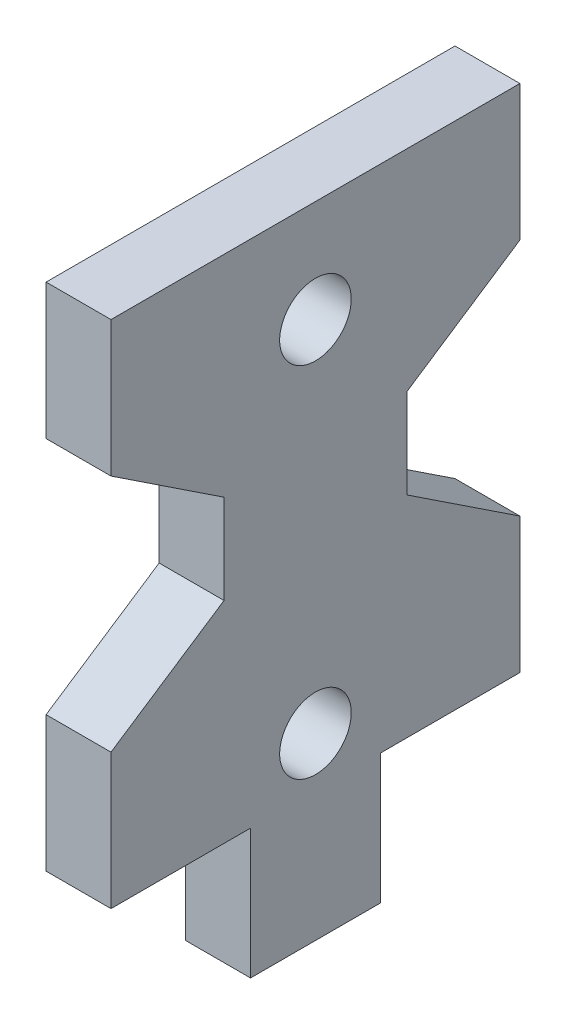
ISO-10303-21;
HEADER;
FILE_DESCRIPTION(('STEP AP214'),'2;1');
FILE_NAME('part.step','',(''),(''),'','','');
FILE_SCHEMA(('AUTOMOTIVE_DESIGN { 1 0 10303 214 1 1 1 1 }'));
ENDSEC;
DATA;
#1=APPLICATION_CONTEXT('core data for automotive mechanical design processes');
#2=APPLICATION_PROTOCOL_DEFINITION('international standard','automotive_design',2000,#1);
#3=PRODUCT_CONTEXT('',#1,'mechanical');
#4=PRODUCT('Part','Part','',(#3));
#5=PRODUCT_RELATED_PRODUCT_CATEGORY('part','',(#4));
#6=PRODUCT_DEFINITION_FORMATION('','',#4);
#7=PRODUCT_DEFINITION_CONTEXT('part definition',#1,'design');
#8=PRODUCT_DEFINITION('design','',#6,#7);
#9=PRODUCT_DEFINITION_SHAPE('','',#8);
#10=(LENGTH_UNIT() NAMED_UNIT(*) SI_UNIT(.MILLI.,.METRE.));
#11=(NAMED_UNIT(*) PLANE_ANGLE_UNIT() SI_UNIT($,.RADIAN.));
#12=(NAMED_UNIT(*) SI_UNIT($,.STERADIAN.) SOLID_ANGLE_UNIT());
#13=UNCERTAINTY_MEASURE_WITH_UNIT(LENGTH_MEASURE(1.E-05),#10,'distance_accuracy_value','');
#14=(GEOMETRIC_REPRESENTATION_CONTEXT(3) GLOBAL_UNCERTAINTY_ASSIGNED_CONTEXT((#13)) GLOBAL_UNIT_ASSIGNED_CONTEXT((#10,
#11,#12)) REPRESENTATION_CONTEXT('',''));
#15=CARTESIAN_POINT('',(0.,0.,0.));
#16=DIRECTION('',(0.,0.,1.));
#17=DIRECTION('',(1.,0.,0.));
#18=AXIS2_PLACEMENT_3D('',#15,#16,#17);
#19=CARTESIAN_POINT('',(3.175,0.,0.));
#20=DIRECTION('',(-1.,0.,0.));
#21=DIRECTION('',(0.,0.,1.));
#22=AXIS2_PLACEMENT_3D('',#19,#20,#21);
#23=PLANE('',#22);
#24=DIRECTION('',(0.,-1.,0.));
#25=VECTOR('',#24,1.);
#26=CARTESIAN_POINT('',(3.175,0.,0.));
#27=LINE('',#26,#25);
#28=CARTESIAN_POINT('',(3.175,6.62957401350551,0.));
#29=VERTEX_POINT('',#28);
#30=CARTESIAN_POINT('',(3.175,0.,0.));
#31=VERTEX_POINT('',#30);
#32=EDGE_CURVE('E236',#29,#31,#27,.T.);
#33=ORIENTED_EDGE('',*,*,#32,.T.);
#34=DIRECTION('',(0.,0.,-1.));
#35=VECTOR('',#34,1.);
#36=CARTESIAN_POINT('',(3.175,0.,0.));
#37=LINE('',#36,#35);
#38=CARTESIAN_POINT('',(3.175,0.,-6.825));
#39=VERTEX_POINT('',#38);
#40=EDGE_CURVE('E124',#31,#39,#37,.T.);
#41=ORIENTED_EDGE('',*,*,#40,.T.);
#42=DIRECTION('',(0.,-1.,0.));
#43=VECTOR('',#42,1.);
#44=CARTESIAN_POINT('',(3.175,-6.35,-6.825));
#45=LINE('',#44,#43);
#46=CARTESIAN_POINT('',(3.175,-6.35,-6.825));
#47=VERTEX_POINT('',#46);
#48=EDGE_CURVE('E289',#39,#47,#45,.T.);
#49=ORIENTED_EDGE('',*,*,#48,.T.);
#50=DIRECTION('',(0.,0.,-1.));
#51=VECTOR('',#50,1.);
#52=CARTESIAN_POINT('',(3.175,-6.35,-6.825));
#53=LINE('',#52,#51);
#54=CARTESIAN_POINT('',(3.175,-6.35,-13.175));
#55=VERTEX_POINT('',#54);
#56=EDGE_CURVE('E309',#47,#55,#53,.T.);
#57=ORIENTED_EDGE('',*,*,#56,.T.);
#58=DIRECTION('',(0.,1.,0.));
#59=VECTOR('',#58,1.);
#60=CARTESIAN_POINT('',(3.175,-6.35,-13.175));
#61=LINE('',#60,#59);
#62=CARTESIAN_POINT('',(3.175,0.,-13.175));
#63=VERTEX_POINT('',#62);
#64=EDGE_CURVE('E305',#55,#63,#61,.T.);
#65=ORIENTED_EDGE('',*,*,#64,.T.);
#66=DIRECTION('',(0.,0.,-1.));
#67=VECTOR('',#66,1.);
#68=CARTESIAN_POINT('',(3.175,0.,-13.175));
#69=LINE('',#68,#67);
#70=CARTESIAN_POINT('',(3.175,0.,-20.));
#71=VERTEX_POINT('',#70);
#72=EDGE_CURVE('E308',#63,#71,#69,.T.);
#73=ORIENTED_EDGE('',*,*,#72,.T.);
#74=DIRECTION('',(0.,1.,0.));
#75=VECTOR('',#74,1.);
#76=CARTESIAN_POINT('',(3.175,0.,-20.));
#77=LINE('',#76,#75);
#78=CARTESIAN_POINT('',(3.175,6.62957401350551,-20.));
#79=VERTEX_POINT('',#78);
#80=EDGE_CURVE('E313',#71,#79,#77,.T.);
#81=ORIENTED_EDGE('',*,*,#80,.T.);
#82=DIRECTION('',(0.,0.551893403229435,0.83391466678062));
#83=VECTOR('',#82,1.);
#84=CARTESIAN_POINT('',(3.175,10.2883921777805,-14.4715009956301));
#85=LINE('',#84,#83);
#86=CARTESIAN_POINT('',(3.175,10.2883921777805,-14.4715009956301));
#87=VERTEX_POINT('',#86);
#88=EDGE_CURVE('E320',#79,#87,#85,.T.);
#89=ORIENTED_EDGE('',*,*,#88,.T.);
#90=DIRECTION('',(0.,1.,0.));
#91=VECTOR('',#90,1.);
#92=CARTESIAN_POINT('',(3.175,14.6636026222195,-14.4715009956301));
#93=LINE('',#92,#91);
#94=CARTESIAN_POINT('',(3.175,14.6636026222195,-14.4715009956301));
#95=VERTEX_POINT('',#94);
#96=EDGE_CURVE('E323',#87,#95,#93,.T.);
#97=ORIENTED_EDGE('',*,*,#96,.T.);
#98=DIRECTION('',(0.,0.551893403229435,-0.83391466678062));
#99=VECTOR('',#98,1.);
#100=CARTESIAN_POINT('',(3.175,18.3224207864945,-20.));
#101=LINE('',#100,#99);
#102=CARTESIAN_POINT('',(3.175,18.3224207864945,-20.));
#103=VERTEX_POINT('',#102);
#104=EDGE_CURVE('E326',#95,#103,#101,.T.);
#105=ORIENTED_EDGE('',*,*,#104,.T.);
#106=DIRECTION('',(0.,1.,0.));
#107=VECTOR('',#106,1.);
#108=CARTESIAN_POINT('',(3.175,18.3224207864945,-20.));
#109=LINE('',#108,#107);
#110=CARTESIAN_POINT('',(3.175,24.9519948,-20.));
#111=VERTEX_POINT('',#110);
#112=EDGE_CURVE('E329',#103,#111,#109,.T.);
#113=ORIENTED_EDGE('',*,*,#112,.T.);
#114=DIRECTION('',(0.,0.,1.));
#115=VECTOR('',#114,1.);
#116=CARTESIAN_POINT('',(3.175,24.9519948,0.));
#117=LINE('',#116,#115);
#118=CARTESIAN_POINT('',(3.175,24.9519948,0.));
#119=VERTEX_POINT('',#118);
#120=EDGE_CURVE('E332',#111,#119,#117,.T.);
#121=ORIENTED_EDGE('',*,*,#120,.T.);
#122=DIRECTION('',(0.,-1.,0.));
#123=VECTOR('',#122,1.);
#124=CARTESIAN_POINT('',(3.175,18.3224207864945,0.));
#125=LINE('',#124,#123);
#126=CARTESIAN_POINT('',(3.175,18.3224207864945,0.));
#127=VERTEX_POINT('',#126);
#128=EDGE_CURVE('E167',#119,#127,#125,.T.);
#129=ORIENTED_EDGE('',*,*,#128,.T.);
#130=DIRECTION('',(0.,-0.551893403229435,-0.83391466678062));
#131=VECTOR('',#130,1.);
#132=CARTESIAN_POINT('',(3.175,18.3224207864945,0.));
#133=LINE('',#132,#131);
#134=CARTESIAN_POINT('',(3.175,14.6636026222195,-5.52849900436991));
#135=VERTEX_POINT('',#134);
#136=EDGE_CURVE('E161',#127,#135,#133,.T.);
#137=ORIENTED_EDGE('',*,*,#136,.T.);
#138=DIRECTION('',(0.,-1.,0.));
#139=VECTOR('',#138,1.);
#140=CARTESIAN_POINT('',(3.175,14.6636026222195,-5.52849900436991));
#141=LINE('',#140,#139);
#142=CARTESIAN_POINT('',(3.175,10.2883921777805,-5.52849900436991));
#143=VERTEX_POINT('',#142);
#144=EDGE_CURVE('E165',#135,#143,#141,.T.);
#145=ORIENTED_EDGE('',*,*,#144,.T.);
#146=DIRECTION('',(0.,-0.551893403229435,0.83391466678062));
#147=VECTOR('',#146,1.);
#148=CARTESIAN_POINT('',(3.175,10.2883921777805,-5.52849900436991));
#149=LINE('',#148,#147);
#150=EDGE_CURVE('E57',#143,#29,#149,.T.);
#151=ORIENTED_EDGE('',*,*,#150,.T.);
#152=EDGE_LOOP('',(#33,#41,#49,#57,#65,#73,#81,#89,#97,#105,#113,#121,#129,#137,#145,#151));
#153=FACE_BOUND('',#152,.T.);
#154=CARTESIAN_POINT('',(3.175,19.9519948,-10.));
#155=DIRECTION('',(1.,0.,0.));
#156=DIRECTION('',(0.,0.,-1.));
#157=AXIS2_PLACEMENT_3D('',#154,#155,#156);
#158=CIRCLE('',#157,1.75);
#159=CARTESIAN_POINT('',(3.175,19.9519948,-11.75));
#160=VERTEX_POINT('',#159);
#161=EDGE_CURVE('E194',#160,#160,#158,.T.);
#162=ORIENTED_EDGE('',*,*,#161,.F.);
#163=EDGE_LOOP('',(#162));
#164=FACE_BOUND('',#163,.T.);
#165=CARTESIAN_POINT('',(3.175,2.4259948,-10.));
#166=DIRECTION('',(1.,0.,0.));
#167=DIRECTION('',(0.,0.,-1.));
#168=AXIS2_PLACEMENT_3D('',#165,#166,#167);
#169=CIRCLE('',#168,1.75);
#170=CARTESIAN_POINT('',(3.175,2.4259948,-11.75));
#171=VERTEX_POINT('',#170);
#172=EDGE_CURVE('E375',#171,#171,#169,.T.);
#173=ORIENTED_EDGE('',*,*,#172,.F.);
#174=EDGE_LOOP('',(#173));
#175=FACE_BOUND('',#174,.T.);
#176=ADVANCED_FACE('F39',(#153,#164,#175),#23,.F.);
#177=CARTESIAN_POINT('',(0.,0.,0.));
#178=DIRECTION('',(-1.,0.,0.));
#179=DIRECTION('',(0.,0.,1.));
#180=AXIS2_PLACEMENT_3D('',#177,#178,#179);
#181=PLANE('',#180);
#182=CARTESIAN_POINT('',(0.,19.9519948,-10.));
#183=DIRECTION('',(1.,0.,0.));
#184=DIRECTION('',(0.,0.,-1.));
#185=AXIS2_PLACEMENT_3D('',#182,#183,#184);
#186=CIRCLE('',#185,1.75);
#187=CARTESIAN_POINT('',(0.,19.9519948,-11.75));
#188=VERTEX_POINT('',#187);
#189=EDGE_CURVE('E382',#188,#188,#186,.T.);
#190=ORIENTED_EDGE('',*,*,#189,.T.);
#191=EDGE_LOOP('',(#190));
#192=FACE_BOUND('',#191,.T.);
#193=DIRECTION('',(0.,-1.,0.));
#194=VECTOR('',#193,1.);
#195=CARTESIAN_POINT('',(0.,0.,0.));
#196=LINE('',#195,#194);
#197=CARTESIAN_POINT('',(0.,6.62957401350551,0.));
#198=VERTEX_POINT('',#197);
#199=CARTESIAN_POINT('',(0.,0.,0.));
#200=VERTEX_POINT('',#199);
#201=EDGE_CURVE('E189',#198,#200,#196,.T.);
#202=ORIENTED_EDGE('',*,*,#201,.F.);
#203=DIRECTION('',(0.,-0.551893403229435,0.83391466678062));
#204=VECTOR('',#203,1.);
#205=CARTESIAN_POINT('',(0.,10.2883921777805,-5.52849900436991));
#206=LINE('',#205,#204);
#207=CARTESIAN_POINT('',(0.,10.2883921777805,-5.52849900436991));
#208=VERTEX_POINT('',#207);
#209=EDGE_CURVE('E116',#208,#198,#206,.T.);
#210=ORIENTED_EDGE('',*,*,#209,.F.);
#211=DIRECTION('',(0.,-1.,0.));
#212=VECTOR('',#211,1.);
#213=CARTESIAN_POINT('',(0.,14.6636026222195,-5.52849900436991));
#214=LINE('',#213,#212);
#215=CARTESIAN_POINT('',(0.,14.6636026222195,-5.52849900436991));
#216=VERTEX_POINT('',#215);
#217=EDGE_CURVE('E110',#216,#208,#214,.T.);
#218=ORIENTED_EDGE('',*,*,#217,.F.);
#219=DIRECTION('',(0.,-0.551893403229435,-0.83391466678062));
#220=VECTOR('',#219,1.);
#221=CARTESIAN_POINT('',(0.,18.3224207864945,0.));
#222=LINE('',#221,#220);
#223=CARTESIAN_POINT('',(0.,18.3224207864945,0.));
#224=VERTEX_POINT('',#223);
#225=EDGE_CURVE('E176',#224,#216,#222,.T.);
#226=ORIENTED_EDGE('',*,*,#225,.F.);
#227=DIRECTION('',(0.,-1.,0.));
#228=VECTOR('',#227,1.);
#229=CARTESIAN_POINT('',(0.,18.3224207864945,0.));
#230=LINE('',#229,#228);
#231=CARTESIAN_POINT('',(0.,24.9519948,0.));
#232=VERTEX_POINT('',#231);
#233=EDGE_CURVE('E227',#232,#224,#230,.T.);
#234=ORIENTED_EDGE('',*,*,#233,.F.);
#235=DIRECTION('',(0.,0.,1.));
#236=VECTOR('',#235,1.);
#237=CARTESIAN_POINT('',(0.,24.9519948,0.));
#238=LINE('',#237,#236);
#239=CARTESIAN_POINT('',(0.,24.9519948,-20.));
#240=VERTEX_POINT('',#239);
#241=EDGE_CURVE('E224',#240,#232,#238,.T.);
#242=ORIENTED_EDGE('',*,*,#241,.F.);
#243=DIRECTION('',(0.,1.,0.));
#244=VECTOR('',#243,1.);
#245=CARTESIAN_POINT('',(0.,18.3224207864945,-20.));
#246=LINE('',#245,#244);
#247=CARTESIAN_POINT('',(0.,18.3224207864945,-20.));
#248=VERTEX_POINT('',#247);
#249=EDGE_CURVE('E221',#248,#240,#246,.T.);
#250=ORIENTED_EDGE('',*,*,#249,.F.);
#251=DIRECTION('',(0.,0.551893403229435,-0.83391466678062));
#252=VECTOR('',#251,1.);
#253=CARTESIAN_POINT('',(0.,18.3224207864945,-20.));
#254=LINE('',#253,#252);
#255=CARTESIAN_POINT('',(0.,14.6636026222195,-14.4715009956301));
#256=VERTEX_POINT('',#255);
#257=EDGE_CURVE('E218',#256,#248,#254,.T.);
#258=ORIENTED_EDGE('',*,*,#257,.F.);
#259=DIRECTION('',(0.,1.,0.));
#260=VECTOR('',#259,1.);
#261=CARTESIAN_POINT('',(0.,14.6636026222195,-14.4715009956301));
#262=LINE('',#261,#260);
#263=CARTESIAN_POINT('',(0.,10.2883921777805,-14.4715009956301));
#264=VERTEX_POINT('',#263);
#265=EDGE_CURVE('E215',#264,#256,#262,.T.);
#266=ORIENTED_EDGE('',*,*,#265,.F.);
#267=DIRECTION('',(0.,0.551893403229435,0.83391466678062));
#268=VECTOR('',#267,1.);
#269=CARTESIAN_POINT('',(0.,10.2883921777805,-14.4715009956301));
#270=LINE('',#269,#268);
#271=CARTESIAN_POINT('',(0.,6.62957401350551,-20.));
#272=VERTEX_POINT('',#271);
#273=EDGE_CURVE('E212',#272,#264,#270,.T.);
#274=ORIENTED_EDGE('',*,*,#273,.F.);
#275=DIRECTION('',(0.,1.,0.));
#276=VECTOR('',#275,1.);
#277=CARTESIAN_POINT('',(0.,0.,-20.));
#278=LINE('',#277,#276);
#279=CARTESIAN_POINT('',(0.,0.,-20.));
#280=VERTEX_POINT('',#279);
#281=EDGE_CURVE('E209',#280,#272,#278,.T.);
#282=ORIENTED_EDGE('',*,*,#281,.F.);
#283=DIRECTION('',(0.,0.,-1.));
#284=VECTOR('',#283,1.);
#285=CARTESIAN_POINT('',(0.,0.,-13.175));
#286=LINE('',#285,#284);
#287=CARTESIAN_POINT('',(0.,0.,-13.175));
#288=VERTEX_POINT('',#287);
#289=EDGE_CURVE('E206',#288,#280,#286,.T.);
#290=ORIENTED_EDGE('',*,*,#289,.F.);
#291=DIRECTION('',(0.,1.,0.));
#292=VECTOR('',#291,1.);
#293=CARTESIAN_POINT('',(0.,-6.35,-13.175));
#294=LINE('',#293,#292);
#295=CARTESIAN_POINT('',(0.,-6.35,-13.175));
#296=VERTEX_POINT('',#295);
#297=EDGE_CURVE('E203',#296,#288,#294,.T.);
#298=ORIENTED_EDGE('',*,*,#297,.F.);
#299=DIRECTION('',(0.,0.,-1.));
#300=VECTOR('',#299,1.);
#301=CARTESIAN_POINT('',(0.,-6.35,-6.825));
#302=LINE('',#301,#300);
#303=CARTESIAN_POINT('',(0.,-6.35,-6.825));
#304=VERTEX_POINT('',#303);
#305=EDGE_CURVE('E200',#304,#296,#302,.T.);
#306=ORIENTED_EDGE('',*,*,#305,.F.);
#307=DIRECTION('',(0.,-1.,0.));
#308=VECTOR('',#307,1.);
#309=CARTESIAN_POINT('',(0.,-6.35,-6.825));
#310=LINE('',#309,#308);
#311=CARTESIAN_POINT('',(0.,0.,-6.825));
#312=VERTEX_POINT('',#311);
#313=EDGE_CURVE('E197',#312,#304,#310,.T.);
#314=ORIENTED_EDGE('',*,*,#313,.F.);
#315=DIRECTION('',(0.,0.,-1.));
#316=VECTOR('',#315,1.);
#317=CARTESIAN_POINT('',(0.,0.,0.));
#318=LINE('',#317,#316);
#319=EDGE_CURVE('E193',#200,#312,#318,.T.);
#320=ORIENTED_EDGE('',*,*,#319,.F.);
#321=EDGE_LOOP('',(#202,#210,#218,#226,#234,#242,#250,#258,#266,#274,#282,#290,#298,#306,#314,#320));
#322=FACE_BOUND('',#321,.T.);
#323=CARTESIAN_POINT('',(0.,2.4259948,-10.));
#324=DIRECTION('',(1.,0.,0.));
#325=DIRECTION('',(0.,0.,-1.));
#326=AXIS2_PLACEMENT_3D('',#323,#324,#325);
#327=CIRCLE('',#326,1.75);
#328=CARTESIAN_POINT('',(0.,2.4259948,-11.75));
#329=VERTEX_POINT('',#328);
#330=EDGE_CURVE('E378',#329,#329,#327,.T.);
#331=ORIENTED_EDGE('',*,*,#330,.T.);
#332=EDGE_LOOP('',(#331));
#333=FACE_BOUND('',#332,.T.);
#334=ADVANCED_FACE('F293',(#192,#322,#333),#181,.T.);
#335=CARTESIAN_POINT('',(3.175,0.,0.));
#336=DIRECTION('',(0.,0.,-1.));
#337=DIRECTION('',(-1.,0.,0.));
#338=AXIS2_PLACEMENT_3D('',#335,#336,#337);
#339=PLANE('',#338);
#340=ORIENTED_EDGE('',*,*,#201,.T.);
#341=DIRECTION('',(-1.,0.,0.));
#342=VECTOR('',#341,1.);
#343=CARTESIAN_POINT('',(3.175,0.,0.));
#344=LINE('',#343,#342);
#345=EDGE_CURVE('E11',#31,#200,#344,.T.);
#346=ORIENTED_EDGE('',*,*,#345,.F.);
#347=ORIENTED_EDGE('',*,*,#32,.F.);
#348=DIRECTION('',(-1.,0.,0.));
#349=VECTOR('',#348,1.);
#350=CARTESIAN_POINT('',(3.175,6.62957401350551,0.));
#351=LINE('',#350,#349);
#352=EDGE_CURVE('E185',#29,#198,#351,.T.);
#353=ORIENTED_EDGE('',*,*,#352,.T.);
#354=EDGE_LOOP('',(#340,#346,#347,#353));
#355=FACE_BOUND('',#354,.T.);
#356=ADVANCED_FACE('F41',(#355),#339,.F.);
#357=CARTESIAN_POINT('',(3.175,0.,0.));
#358=DIRECTION('',(0.,1.,0.));
#359=DIRECTION('',(0.,0.,1.));
#360=AXIS2_PLACEMENT_3D('',#357,#358,#359);
#361=PLANE('',#360);
#362=ORIENTED_EDGE('',*,*,#319,.T.);
#363=DIRECTION('',(-1.,0.,0.));
#364=VECTOR('',#363,1.);
#365=CARTESIAN_POINT('',(3.175,0.,-6.825));
#366=LINE('',#365,#364);
#367=EDGE_CURVE('E49',#39,#312,#366,.T.);
#368=ORIENTED_EDGE('',*,*,#367,.F.);
#369=ORIENTED_EDGE('',*,*,#40,.F.);
#370=ORIENTED_EDGE('',*,*,#345,.T.);
#371=EDGE_LOOP('',(#362,#368,#369,#370));
#372=FACE_BOUND('',#371,.T.);
#373=ADVANCED_FACE('F522',(#372),#361,.F.);
#374=CARTESIAN_POINT('',(3.175,-6.35,-6.825));
#375=DIRECTION('',(0.,0.,-1.));
#376=DIRECTION('',(-1.,0.,0.));
#377=AXIS2_PLACEMENT_3D('',#374,#375,#376);
#378=PLANE('',#377);
#379=ORIENTED_EDGE('',*,*,#313,.T.);
#380=DIRECTION('',(-1.,0.,0.));
#381=VECTOR('',#380,1.);
#382=CARTESIAN_POINT('',(3.175,-6.35,-6.825));
#383=LINE('',#382,#381);
#384=EDGE_CURVE('E279',#47,#304,#383,.T.);
#385=ORIENTED_EDGE('',*,*,#384,.F.);
#386=ORIENTED_EDGE('',*,*,#48,.F.);
#387=ORIENTED_EDGE('',*,*,#367,.T.);
#388=EDGE_LOOP('',(#379,#385,#386,#387));
#389=FACE_BOUND('',#388,.T.);
#390=ADVANCED_FACE('F287',(#389),#378,.F.);
#391=CARTESIAN_POINT('',(3.175,-6.35,-6.825));
#392=DIRECTION('',(0.,1.,0.));
#393=DIRECTION('',(0.,0.,1.));
#394=AXIS2_PLACEMENT_3D('',#391,#392,#393);
#395=PLANE('',#394);
#396=ORIENTED_EDGE('',*,*,#305,.T.);
#397=DIRECTION('',(-1.,0.,0.));
#398=VECTOR('',#397,1.);
#399=CARTESIAN_POINT('',(3.175,-6.35,-13.175));
#400=LINE('',#399,#398);
#401=EDGE_CURVE('E275',#55,#296,#400,.T.);
#402=ORIENTED_EDGE('',*,*,#401,.F.);
#403=ORIENTED_EDGE('',*,*,#56,.F.);
#404=ORIENTED_EDGE('',*,*,#384,.T.);
#405=EDGE_LOOP('',(#396,#402,#403,#404));
#406=FACE_BOUND('',#405,.T.);
#407=ADVANCED_FACE('F299',(#406),#395,.F.);
#408=CARTESIAN_POINT('',(3.175,-6.35,-13.175));
#409=DIRECTION('',(0.,0.,1.));
#410=DIRECTION('',(1.,0.,0.));
#411=AXIS2_PLACEMENT_3D('',#408,#409,#410);
#412=PLANE('',#411);
#413=ORIENTED_EDGE('',*,*,#297,.T.);
#414=DIRECTION('',(-1.,0.,0.));
#415=VECTOR('',#414,1.);
#416=CARTESIAN_POINT('',(3.175,0.,-13.175));
#417=LINE('',#416,#415);
#418=EDGE_CURVE('E271',#63,#288,#417,.T.);
#419=ORIENTED_EDGE('',*,*,#418,.F.);
#420=ORIENTED_EDGE('',*,*,#64,.F.);
#421=ORIENTED_EDGE('',*,*,#401,.T.);
#422=EDGE_LOOP('',(#413,#419,#420,#421));
#423=FACE_BOUND('',#422,.T.);
#424=ADVANCED_FACE('F303',(#423),#412,.F.);
#425=CARTESIAN_POINT('',(3.175,0.,-13.175));
#426=DIRECTION('',(0.,1.,0.));
#427=DIRECTION('',(0.,0.,1.));
#428=AXIS2_PLACEMENT_3D('',#425,#426,#427);
#429=PLANE('',#428);
#430=ORIENTED_EDGE('',*,*,#289,.T.);
#431=DIRECTION('',(-1.,0.,0.));
#432=VECTOR('',#431,1.);
#433=CARTESIAN_POINT('',(3.175,0.,-20.));
#434=LINE('',#433,#432);
#435=EDGE_CURVE('E267',#71,#280,#434,.T.);
#436=ORIENTED_EDGE('',*,*,#435,.F.);
#437=ORIENTED_EDGE('',*,*,#72,.F.);
#438=ORIENTED_EDGE('',*,*,#418,.T.);
#439=EDGE_LOOP('',(#430,#436,#437,#438));
#440=FACE_BOUND('',#439,.T.);
#441=ADVANCED_FACE('F487',(#440),#429,.F.);
#442=CARTESIAN_POINT('',(3.175,0.,-20.));
#443=DIRECTION('',(0.,0.,1.));
#444=DIRECTION('',(0.,-1.,0.));
#445=AXIS2_PLACEMENT_3D('',#442,#443,#444);
#446=PLANE('',#445);
#447=ORIENTED_EDGE('',*,*,#281,.T.);
#448=DIRECTION('',(-1.,0.,0.));
#449=VECTOR('',#448,1.);
#450=CARTESIAN_POINT('',(3.175,6.62957401350551,-20.));
#451=LINE('',#450,#449);
#452=EDGE_CURVE('E263',#79,#272,#451,.T.);
#453=ORIENTED_EDGE('',*,*,#452,.F.);
#454=ORIENTED_EDGE('',*,*,#80,.F.);
#455=ORIENTED_EDGE('',*,*,#435,.T.);
#456=EDGE_LOOP('',(#447,#453,#454,#455));
#457=FACE_BOUND('',#456,.T.);
#458=ADVANCED_FACE('F477',(#457),#446,.F.);
#459=CARTESIAN_POINT('',(3.175,10.2883921777805,-14.4715009956301));
#460=DIRECTION('',(0.,-0.83391466678062,0.551893403229435));
#461=DIRECTION('',(0.,-0.551893403229435,-0.83391466678062));
#462=AXIS2_PLACEMENT_3D('',#459,#460,#461);
#463=PLANE('',#462);
#464=ORIENTED_EDGE('',*,*,#273,.T.);
#465=DIRECTION('',(-1.,0.,0.));
#466=VECTOR('',#465,1.);
#467=CARTESIAN_POINT('',(3.175,10.2883921777805,-14.4715009956301));
#468=LINE('',#467,#466);
#469=EDGE_CURVE('E259',#87,#264,#468,.T.);
#470=ORIENTED_EDGE('',*,*,#469,.F.);
#471=ORIENTED_EDGE('',*,*,#88,.F.);
#472=ORIENTED_EDGE('',*,*,#452,.T.);
#473=EDGE_LOOP('',(#464,#470,#471,#472));
#474=FACE_BOUND('',#473,.T.);
#475=ADVANCED_FACE('F467',(#474),#463,.F.);
#476=CARTESIAN_POINT('',(3.175,14.6636026222195,-14.4715009956301));
#477=DIRECTION('',(0.,0.,1.));
#478=DIRECTION('',(0.,-1.,0.));
#479=AXIS2_PLACEMENT_3D('',#476,#477,#478);
#480=PLANE('',#479);
#481=ORIENTED_EDGE('',*,*,#265,.T.);
#482=DIRECTION('',(-1.,0.,0.));
#483=VECTOR('',#482,1.);
#484=CARTESIAN_POINT('',(3.175,14.6636026222195,-14.4715009956301));
#485=LINE('',#484,#483);
#486=EDGE_CURVE('E255',#95,#256,#485,.T.);
#487=ORIENTED_EDGE('',*,*,#486,.F.);
#488=ORIENTED_EDGE('',*,*,#96,.F.);
#489=ORIENTED_EDGE('',*,*,#469,.T.);
#490=EDGE_LOOP('',(#481,#487,#488,#489));
#491=FACE_BOUND('',#490,.T.);
#492=ADVANCED_FACE('F457',(#491),#480,.F.);
#493=CARTESIAN_POINT('',(3.175,18.3224207864945,-20.));
#494=DIRECTION('',(0.,0.83391466678062,0.551893403229435));
#495=DIRECTION('',(0.,-0.551893403229435,0.83391466678062));
#496=AXIS2_PLACEMENT_3D('',#493,#494,#495);
#497=PLANE('',#496);
#498=ORIENTED_EDGE('',*,*,#257,.T.);
#499=DIRECTION('',(-1.,0.,0.));
#500=VECTOR('',#499,1.);
#501=CARTESIAN_POINT('',(3.175,18.3224207864945,-20.));
#502=LINE('',#501,#500);
#503=EDGE_CURVE('E251',#103,#248,#502,.T.);
#504=ORIENTED_EDGE('',*,*,#503,.F.);
#505=ORIENTED_EDGE('',*,*,#104,.F.);
#506=ORIENTED_EDGE('',*,*,#486,.T.);
#507=EDGE_LOOP('',(#498,#504,#505,#506));
#508=FACE_BOUND('',#507,.T.);
#509=ADVANCED_FACE('F447',(#508),#497,.F.);
#510=CARTESIAN_POINT('',(3.175,18.3224207864945,-20.));
#511=DIRECTION('',(0.,0.,1.));
#512=DIRECTION('',(0.,-1.,0.));
#513=AXIS2_PLACEMENT_3D('',#510,#511,#512);
#514=PLANE('',#513);
#515=ORIENTED_EDGE('',*,*,#249,.T.);
#516=DIRECTION('',(-1.,0.,0.));
#517=VECTOR('',#516,1.);
#518=CARTESIAN_POINT('',(3.175,24.9519948,-20.));
#519=LINE('',#518,#517);
#520=EDGE_CURVE('E247',#111,#240,#519,.T.);
#521=ORIENTED_EDGE('',*,*,#520,.F.);
#522=ORIENTED_EDGE('',*,*,#112,.F.);
#523=ORIENTED_EDGE('',*,*,#503,.T.);
#524=EDGE_LOOP('',(#515,#521,#522,#523));
#525=FACE_BOUND('',#524,.T.);
#526=ADVANCED_FACE('F438',(#525),#514,.F.);
#527=CARTESIAN_POINT('',(3.175,24.9519948,0.));
#528=DIRECTION('',(0.,-1.,0.));
#529=DIRECTION('',(0.,0.,-1.));
#530=AXIS2_PLACEMENT_3D('',#527,#528,#529);
#531=PLANE('',#530);
#532=ORIENTED_EDGE('',*,*,#241,.T.);
#533=DIRECTION('',(-1.,0.,0.));
#534=VECTOR('',#533,1.);
#535=CARTESIAN_POINT('',(3.175,24.9519948,0.));
#536=LINE('',#535,#534);
#537=EDGE_CURVE('E243',#119,#232,#536,.T.);
#538=ORIENTED_EDGE('',*,*,#537,.F.);
#539=ORIENTED_EDGE('',*,*,#120,.F.);
#540=ORIENTED_EDGE('',*,*,#520,.T.);
#541=EDGE_LOOP('',(#532,#538,#539,#540));
#542=FACE_BOUND('',#541,.T.);
#543=ADVANCED_FACE('F340',(#542),#531,.F.);
#544=CARTESIAN_POINT('',(3.175,18.3224207864945,0.));
#545=DIRECTION('',(0.,0.,-1.));
#546=DIRECTION('',(-1.,0.,0.));
#547=AXIS2_PLACEMENT_3D('',#544,#545,#546);
#548=PLANE('',#547);
#549=ORIENTED_EDGE('',*,*,#233,.T.);
#550=DIRECTION('',(-1.,0.,0.));
#551=VECTOR('',#550,1.);
#552=CARTESIAN_POINT('',(3.175,18.3224207864945,0.));
#553=LINE('',#552,#551);
#554=EDGE_CURVE('E178',#127,#224,#553,.T.);
#555=ORIENTED_EDGE('',*,*,#554,.F.);
#556=ORIENTED_EDGE('',*,*,#128,.F.);
#557=ORIENTED_EDGE('',*,*,#537,.T.);
#558=EDGE_LOOP('',(#549,#555,#556,#557));
#559=FACE_BOUND('',#558,.T.);
#560=ADVANCED_FACE('F344',(#559),#548,.F.);
#561=CARTESIAN_POINT('',(3.175,18.3224207864945,0.));
#562=DIRECTION('',(0.,0.83391466678062,-0.551893403229435));
#563=DIRECTION('',(0.,0.551893403229435,0.83391466678062));
#564=AXIS2_PLACEMENT_3D('',#561,#562,#563);
#565=PLANE('',#564);
#566=ORIENTED_EDGE('',*,*,#225,.T.);
#567=DIRECTION('',(-1.,0.,0.));
#568=VECTOR('',#567,1.);
#569=CARTESIAN_POINT('',(3.175,14.6636026222195,-5.52849900436991));
#570=LINE('',#569,#568);
#571=EDGE_CURVE('E173',#135,#216,#570,.T.);
#572=ORIENTED_EDGE('',*,*,#571,.F.);
#573=ORIENTED_EDGE('',*,*,#136,.F.);
#574=ORIENTED_EDGE('',*,*,#554,.T.);
#575=EDGE_LOOP('',(#566,#572,#573,#574));
#576=FACE_BOUND('',#575,.T.);
#577=ADVANCED_FACE('F174',(#576),#565,.F.);
#578=CARTESIAN_POINT('',(3.175,14.6636026222195,-5.52849900436991));
#579=DIRECTION('',(0.,0.,-1.));
#580=DIRECTION('',(-1.,0.,0.));
#581=AXIS2_PLACEMENT_3D('',#578,#579,#580);
#582=PLANE('',#581);
#583=ORIENTED_EDGE('',*,*,#217,.T.);
#584=DIRECTION('',(-1.,0.,0.));
#585=VECTOR('',#584,1.);
#586=CARTESIAN_POINT('',(3.175,10.2883921777805,-5.52849900436991));
#587=LINE('',#586,#585);
#588=EDGE_CURVE('E179',#143,#208,#587,.T.);
#589=ORIENTED_EDGE('',*,*,#588,.F.);
#590=ORIENTED_EDGE('',*,*,#144,.F.);
#591=ORIENTED_EDGE('',*,*,#571,.T.);
#592=EDGE_LOOP('',(#583,#589,#590,#591));
#593=FACE_BOUND('',#592,.T.);
#594=ADVANCED_FACE('F181',(#593),#582,.F.);
#595=CARTESIAN_POINT('',(3.175,10.2883921777805,-5.52849900436991));
#596=DIRECTION('',(0.,-0.83391466678062,-0.551893403229435));
#597=DIRECTION('',(0.,0.551893403229435,-0.83391466678062));
#598=AXIS2_PLACEMENT_3D('',#595,#596,#597);
#599=PLANE('',#598);
#600=ORIENTED_EDGE('',*,*,#209,.T.);
#601=ORIENTED_EDGE('',*,*,#352,.F.);
#602=ORIENTED_EDGE('',*,*,#150,.F.);
#603=ORIENTED_EDGE('',*,*,#588,.T.);
#604=EDGE_LOOP('',(#600,#601,#602,#603));
#605=FACE_BOUND('',#604,.T.);
#606=ADVANCED_FACE('F348',(#605),#599,.F.);
#607=CARTESIAN_POINT('',(3.175,19.9519948,-10.));
#608=DIRECTION('',(-1.,0.,0.));
#609=DIRECTION('',(0.,0.,1.));
#610=AXIS2_PLACEMENT_3D('',#607,#608,#609);
#611=CYLINDRICAL_SURFACE('',#610,1.75);
#612=ORIENTED_EDGE('',*,*,#161,.T.);
#613=EDGE_LOOP('',(#612));
#614=FACE_BOUND('',#613,.T.);
#615=ORIENTED_EDGE('',*,*,#189,.F.);
#616=EDGE_LOOP('',(#615));
#617=FACE_BOUND('',#616,.T.);
#618=ADVANCED_FACE('F350',(#614,#617),#611,.F.);
#619=CARTESIAN_POINT('',(3.175,2.4259948,-10.));
#620=DIRECTION('',(-1.,0.,0.));
#621=DIRECTION('',(0.,0.,1.));
#622=AXIS2_PLACEMENT_3D('',#619,#620,#621);
#623=CYLINDRICAL_SURFACE('',#622,1.75);
#624=ORIENTED_EDGE('',*,*,#172,.T.);
#625=EDGE_LOOP('',(#624));
#626=FACE_BOUND('',#625,.T.);
#627=ORIENTED_EDGE('',*,*,#330,.F.);
#628=EDGE_LOOP('',(#627));
#629=FACE_BOUND('',#628,.T.);
#630=ADVANCED_FACE('F356',(#626,#629),#623,.F.);
#631=CLOSED_SHELL('',(#176,#334,#356,#373,#390,#407,#424,#441,#458,#475,#492,#509,#526,#543,
#560,#577,#594,#606,#618,#630));
#632=MANIFOLD_SOLID_BREP('B2',#631);
#633=ADVANCED_BREP_SHAPE_REPRESENTATION('',(#18,#632),#14);
#634=SHAPE_DEFINITION_REPRESENTATION(#9,#633);
ENDSEC;
END-ISO-10303-21;
